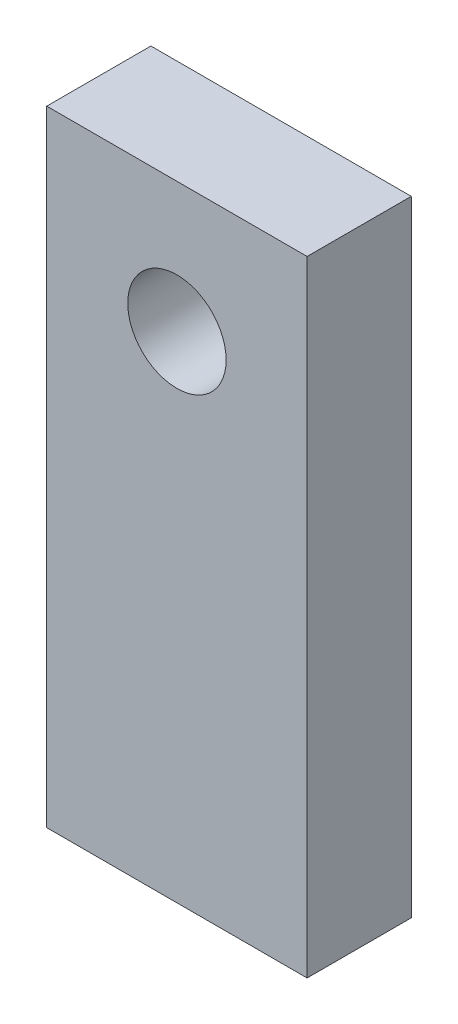
ISO-10303-21;
HEADER;
FILE_DESCRIPTION(('STEP AP214'),'2;1');
FILE_NAME('part.step','',(''),(''),'','','');
FILE_SCHEMA(('AUTOMOTIVE_DESIGN { 1 0 10303 214 1 1 1 1 }'));
ENDSEC;
DATA;
#1=APPLICATION_CONTEXT('core data for automotive mechanical design processes');
#2=APPLICATION_PROTOCOL_DEFINITION('international standard','automotive_design',2000,#1);
#3=PRODUCT_CONTEXT('',#1,'mechanical');
#4=PRODUCT('Part','Part','',(#3));
#5=PRODUCT_RELATED_PRODUCT_CATEGORY('part','',(#4));
#6=PRODUCT_DEFINITION_FORMATION('','',#4);
#7=PRODUCT_DEFINITION_CONTEXT('part definition',#1,'design');
#8=PRODUCT_DEFINITION('design','',#6,#7);
#9=PRODUCT_DEFINITION_SHAPE('','',#8);
#10=(LENGTH_UNIT() NAMED_UNIT(*) SI_UNIT(.MILLI.,.METRE.));
#11=(NAMED_UNIT(*) PLANE_ANGLE_UNIT() SI_UNIT($,.RADIAN.));
#12=(NAMED_UNIT(*) SI_UNIT($,.STERADIAN.) SOLID_ANGLE_UNIT());
#13=UNCERTAINTY_MEASURE_WITH_UNIT(LENGTH_MEASURE(1.E-05),#10,'distance_accuracy_value','');
#14=(GEOMETRIC_REPRESENTATION_CONTEXT(3) GLOBAL_UNCERTAINTY_ASSIGNED_CONTEXT((#13)) GLOBAL_UNIT_ASSIGNED_CONTEXT((#10,
#11,#12)) REPRESENTATION_CONTEXT('',''));
#15=CARTESIAN_POINT('',(0.,0.,0.));
#16=DIRECTION('',(0.,0.,1.));
#17=DIRECTION('',(1.,0.,0.));
#18=AXIS2_PLACEMENT_3D('',#15,#16,#17);
#19=CARTESIAN_POINT('',(6.35,0.,2.54));
#20=DIRECTION('',(0.,1.,0.));
#21=DIRECTION('',(-1.,0.,0.));
#22=AXIS2_PLACEMENT_3D('',#19,#20,#21);
#23=PLANE('',#22);
#24=DIRECTION('',(1.,0.,0.));
#25=VECTOR('',#24,1.);
#26=CARTESIAN_POINT('',(6.35,0.,0.));
#27=LINE('',#26,#25);
#28=CARTESIAN_POINT('',(0.,0.,0.));
#29=VERTEX_POINT('',#28);
#30=CARTESIAN_POINT('',(6.35,0.,0.));
#31=VERTEX_POINT('',#30);
#32=EDGE_CURVE('E96',#29,#31,#27,.T.);
#33=ORIENTED_EDGE('',*,*,#32,.T.);
#34=DIRECTION('',(0.,0.,-1.));
#35=VECTOR('',#34,1.);
#36=CARTESIAN_POINT('',(6.35,0.,2.54));
#37=LINE('',#36,#35);
#38=CARTESIAN_POINT('',(6.35,0.,2.54));
#39=VERTEX_POINT('',#38);
#40=EDGE_CURVE('E11',#39,#31,#37,.T.);
#41=ORIENTED_EDGE('',*,*,#40,.F.);
#42=DIRECTION('',(1.,0.,0.));
#43=VECTOR('',#42,1.);
#44=CARTESIAN_POINT('',(6.35,0.,2.54));
#45=LINE('',#44,#43);
#46=CARTESIAN_POINT('',(0.,0.,2.54));
#47=VERTEX_POINT('',#46);
#48=EDGE_CURVE('E84',#47,#39,#45,.T.);
#49=ORIENTED_EDGE('',*,*,#48,.F.);
#50=DIRECTION('',(0.,0.,-1.));
#51=VECTOR('',#50,1.);
#52=CARTESIAN_POINT('',(0.,0.,2.54));
#53=LINE('',#52,#51);
#54=EDGE_CURVE('E92',#47,#29,#53,.T.);
#55=ORIENTED_EDGE('',*,*,#54,.T.);
#56=EDGE_LOOP('',(#33,#41,#49,#55));
#57=FACE_BOUND('',#56,.T.);
#58=ADVANCED_FACE('F33',(#57),#23,.F.);
#59=CARTESIAN_POINT('',(6.35,15.24,2.54));
#60=DIRECTION('',(-1.,0.,0.));
#61=DIRECTION('',(0.,-1.,0.));
#62=AXIS2_PLACEMENT_3D('',#59,#60,#61);
#63=PLANE('',#62);
#64=DIRECTION('',(0.,1.,0.));
#65=VECTOR('',#64,1.);
#66=CARTESIAN_POINT('',(6.35,15.24,0.));
#67=LINE('',#66,#65);
#68=CARTESIAN_POINT('',(6.35,15.24,0.));
#69=VERTEX_POINT('',#68);
#70=EDGE_CURVE('E88',#31,#69,#67,.T.);
#71=ORIENTED_EDGE('',*,*,#70,.T.);
#72=DIRECTION('',(0.,0.,-1.));
#73=VECTOR('',#72,1.);
#74=CARTESIAN_POINT('',(6.35,15.24,2.54));
#75=LINE('',#74,#73);
#76=CARTESIAN_POINT('',(6.35,15.24,2.54));
#77=VERTEX_POINT('',#76);
#78=EDGE_CURVE('E41',#77,#69,#75,.T.);
#79=ORIENTED_EDGE('',*,*,#78,.F.);
#80=DIRECTION('',(0.,1.,0.));
#81=VECTOR('',#80,1.);
#82=CARTESIAN_POINT('',(6.35,15.24,2.54));
#83=LINE('',#82,#81);
#84=EDGE_CURVE('E79',#39,#77,#83,.T.);
#85=ORIENTED_EDGE('',*,*,#84,.F.);
#86=ORIENTED_EDGE('',*,*,#40,.T.);
#87=EDGE_LOOP('',(#71,#79,#85,#86));
#88=FACE_BOUND('',#87,.T.);
#89=ADVANCED_FACE('F87',(#88),#63,.F.);
#90=CARTESIAN_POINT('',(0.,15.24,2.54));
#91=DIRECTION('',(0.,-1.,0.));
#92=DIRECTION('',(0.,0.,-1.));
#93=AXIS2_PLACEMENT_3D('',#90,#91,#92);
#94=PLANE('',#93);
#95=DIRECTION('',(-1.,0.,0.));
#96=VECTOR('',#95,1.);
#97=CARTESIAN_POINT('',(0.,15.24,0.));
#98=LINE('',#97,#96);
#99=CARTESIAN_POINT('',(0.,15.24,0.));
#100=VERTEX_POINT('',#99);
#101=EDGE_CURVE('E66',#69,#100,#98,.T.);
#102=ORIENTED_EDGE('',*,*,#101,.T.);
#103=DIRECTION('',(0.,0.,-1.));
#104=VECTOR('',#103,1.);
#105=CARTESIAN_POINT('',(0.,15.24,2.54));
#106=LINE('',#105,#104);
#107=CARTESIAN_POINT('',(0.,15.24,2.54));
#108=VERTEX_POINT('',#107);
#109=EDGE_CURVE('E89',#108,#100,#106,.T.);
#110=ORIENTED_EDGE('',*,*,#109,.F.);
#111=DIRECTION('',(-1.,0.,0.));
#112=VECTOR('',#111,1.);
#113=CARTESIAN_POINT('',(0.,15.24,2.54));
#114=LINE('',#113,#112);
#115=EDGE_CURVE('E82',#77,#108,#114,.T.);
#116=ORIENTED_EDGE('',*,*,#115,.F.);
#117=ORIENTED_EDGE('',*,*,#78,.T.);
#118=EDGE_LOOP('',(#102,#110,#116,#117));
#119=FACE_BOUND('',#118,.T.);
#120=ADVANCED_FACE('F90',(#119),#94,.F.);
#121=CARTESIAN_POINT('',(0.,0.,2.54));
#122=DIRECTION('',(1.,0.,0.));
#123=DIRECTION('',(0.,0.,-1.));
#124=AXIS2_PLACEMENT_3D('',#121,#122,#123);
#125=PLANE('',#124);
#126=DIRECTION('',(0.,-1.,0.));
#127=VECTOR('',#126,1.);
#128=CARTESIAN_POINT('',(0.,0.,0.));
#129=LINE('',#128,#127);
#130=EDGE_CURVE('E72',#100,#29,#129,.T.);
#131=ORIENTED_EDGE('',*,*,#130,.T.);
#132=ORIENTED_EDGE('',*,*,#54,.F.);
#133=DIRECTION('',(0.,-1.,0.));
#134=VECTOR('',#133,1.);
#135=CARTESIAN_POINT('',(0.,0.,2.54));
#136=LINE('',#135,#134);
#137=EDGE_CURVE('E49',#108,#47,#136,.T.);
#138=ORIENTED_EDGE('',*,*,#137,.F.);
#139=ORIENTED_EDGE('',*,*,#109,.T.);
#140=EDGE_LOOP('',(#131,#132,#138,#139));
#141=FACE_BOUND('',#140,.T.);
#142=ADVANCED_FACE('F104',(#141),#125,.F.);
#143=CARTESIAN_POINT('',(0.,0.,2.54));
#144=DIRECTION('',(0.,0.,-1.));
#145=DIRECTION('',(-1.,0.,0.));
#146=AXIS2_PLACEMENT_3D('',#143,#144,#145);
#147=PLANE('',#146);
#148=CARTESIAN_POINT('',(3.175,12.065,2.54));
#149=DIRECTION('',(0.,0.,1.));
#150=DIRECTION('',(1.,0.,0.));
#151=AXIS2_PLACEMENT_3D('',#148,#149,#150);
#152=CIRCLE('',#151,1.2);
#153=CARTESIAN_POINT('',(4.375,12.065,2.54));
#154=VERTEX_POINT('',#153);
#155=EDGE_CURVE('E112',#154,#154,#152,.T.);
#156=ORIENTED_EDGE('',*,*,#155,.F.);
#157=EDGE_LOOP('',(#156));
#158=FACE_BOUND('',#157,.T.);
#159=ORIENTED_EDGE('',*,*,#48,.T.);
#160=ORIENTED_EDGE('',*,*,#84,.T.);
#161=ORIENTED_EDGE('',*,*,#115,.T.);
#162=ORIENTED_EDGE('',*,*,#137,.T.);
#163=EDGE_LOOP('',(#159,#160,#161,#162));
#164=FACE_BOUND('',#163,.T.);
#165=ADVANCED_FACE('F80',(#158,#164),#147,.F.);
#166=CARTESIAN_POINT('',(0.,0.,0.));
#167=DIRECTION('',(0.,0.,-1.));
#168=DIRECTION('',(-1.,0.,0.));
#169=AXIS2_PLACEMENT_3D('',#166,#167,#168);
#170=PLANE('',#169);
#171=CARTESIAN_POINT('',(3.175,12.065,0.));
#172=DIRECTION('',(0.,0.,-1.));
#173=DIRECTION('',(-1.,0.,0.));
#174=AXIS2_PLACEMENT_3D('',#171,#172,#173);
#175=CIRCLE('',#174,1.2);
#176=CARTESIAN_POINT('',(1.975,12.065,0.));
#177=VERTEX_POINT('',#176);
#178=EDGE_CURVE('E99',#177,#177,#175,.T.);
#179=ORIENTED_EDGE('',*,*,#178,.F.);
#180=EDGE_LOOP('',(#179));
#181=FACE_BOUND('',#180,.T.);
#182=ORIENTED_EDGE('',*,*,#32,.F.);
#183=ORIENTED_EDGE('',*,*,#130,.F.);
#184=ORIENTED_EDGE('',*,*,#101,.F.);
#185=ORIENTED_EDGE('',*,*,#70,.F.);
#186=EDGE_LOOP('',(#182,#183,#184,#185));
#187=FACE_BOUND('',#186,.T.);
#188=ADVANCED_FACE('F107',(#181,#187),#170,.T.);
#189=CARTESIAN_POINT('',(3.175,12.065,2.54));
#190=DIRECTION('',(0.,0.,1.));
#191=DIRECTION('',(1.,0.,0.));
#192=AXIS2_PLACEMENT_3D('',#189,#190,#191);
#193=CYLINDRICAL_SURFACE('',#192,1.2);
#194=ORIENTED_EDGE('',*,*,#178,.T.);
#195=EDGE_LOOP('',(#194));
#196=FACE_BOUND('',#195,.T.);
#197=ORIENTED_EDGE('',*,*,#155,.T.);
#198=EDGE_LOOP('',(#197));
#199=FACE_BOUND('',#198,.T.);
#200=ADVANCED_FACE('F116',(#196,#199),#193,.F.);
#201=CLOSED_SHELL('',(#58,#89,#120,#142,#165,#188,#200));
#202=MANIFOLD_SOLID_BREP('B2',#201);
#203=ADVANCED_BREP_SHAPE_REPRESENTATION('',(#18,#202),#14);
#204=SHAPE_DEFINITION_REPRESENTATION(#9,#203);
ENDSEC;
END-ISO-10303-21;
